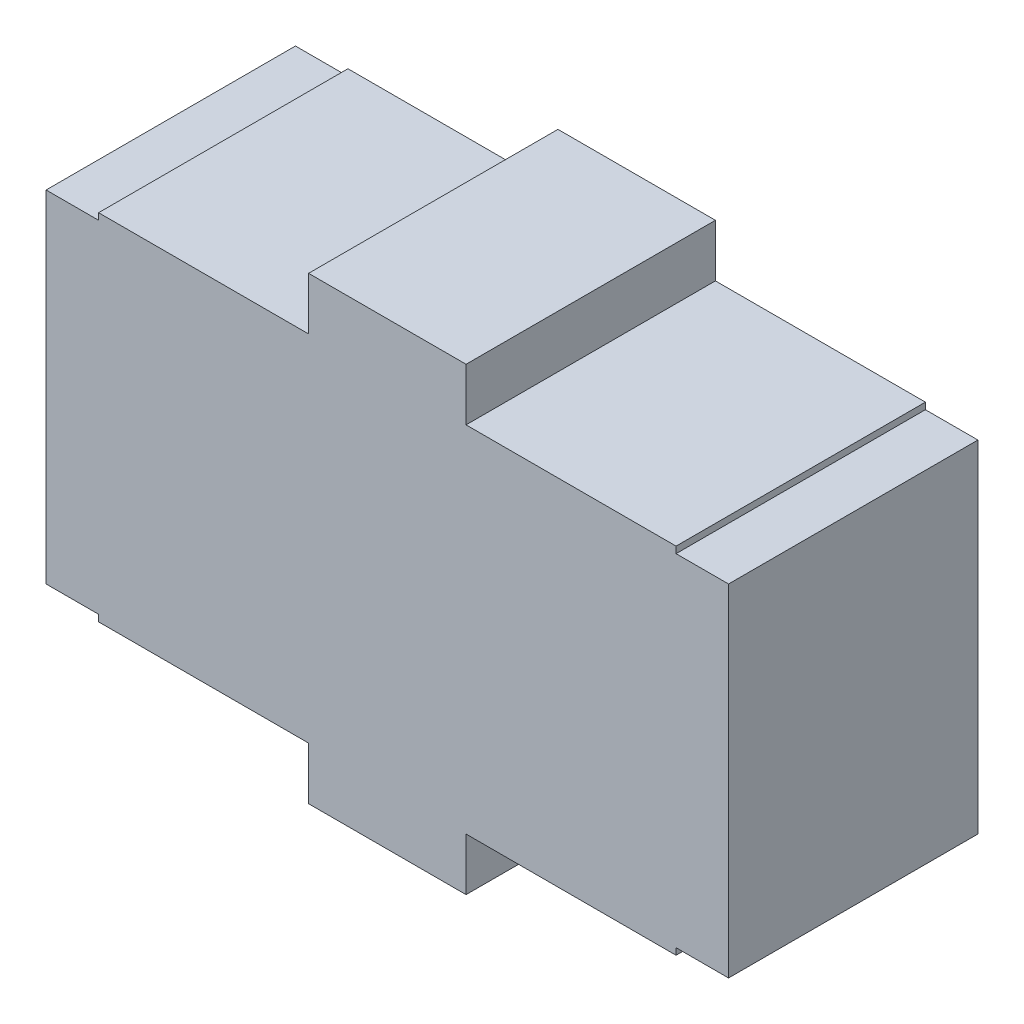
ISO-10303-21;
HEADER;
FILE_DESCRIPTION(('STEP AP214'),'2;1');
FILE_NAME('part.step','',(''),(''),'','','');
FILE_SCHEMA(('AUTOMOTIVE_DESIGN { 1 0 10303 214 1 1 1 1 }'));
ENDSEC;
DATA;
#1=APPLICATION_CONTEXT('core data for automotive mechanical design processes');
#2=APPLICATION_PROTOCOL_DEFINITION('international standard','automotive_design',2000,#1);
#3=PRODUCT_CONTEXT('',#1,'mechanical');
#4=PRODUCT('Part','Part','',(#3));
#5=PRODUCT_RELATED_PRODUCT_CATEGORY('part','',(#4));
#6=PRODUCT_DEFINITION_FORMATION('','',#4);
#7=PRODUCT_DEFINITION_CONTEXT('part definition',#1,'design');
#8=PRODUCT_DEFINITION('design','',#6,#7);
#9=PRODUCT_DEFINITION_SHAPE('','',#8);
#10=(LENGTH_UNIT() NAMED_UNIT(*) SI_UNIT(.MILLI.,.METRE.));
#11=(NAMED_UNIT(*) PLANE_ANGLE_UNIT() SI_UNIT($,.RADIAN.));
#12=(NAMED_UNIT(*) SI_UNIT($,.STERADIAN.) SOLID_ANGLE_UNIT());
#13=UNCERTAINTY_MEASURE_WITH_UNIT(LENGTH_MEASURE(1.E-05),#10,'distance_accuracy_value','');
#14=(GEOMETRIC_REPRESENTATION_CONTEXT(3) GLOBAL_UNCERTAINTY_ASSIGNED_CONTEXT((#13)) GLOBAL_UNIT_ASSIGNED_CONTEXT((#10,
#11,#12)) REPRESENTATION_CONTEXT('',''));
#15=CARTESIAN_POINT('',(0.,0.,0.));
#16=DIRECTION('',(0.,0.,1.));
#17=DIRECTION('',(1.,0.,0.));
#18=AXIS2_PLACEMENT_3D('',#15,#16,#17);
#19=CARTESIAN_POINT('',(0.3,-0.875,0.95));
#20=DIRECTION('',(0.,1.,0.));
#21=DIRECTION('',(0.,0.,1.));
#22=AXIS2_PLACEMENT_3D('',#19,#20,#21);
#23=PLANE('',#22);
#24=DIRECTION('',(1.,0.,0.));
#25=VECTOR('',#24,1.);
#26=CARTESIAN_POINT('',(0.3,-0.875,0.));
#27=LINE('',#26,#25);
#28=CARTESIAN_POINT('',(-0.3,-0.875,0.));
#29=VERTEX_POINT('',#28);
#30=CARTESIAN_POINT('',(0.3,-0.875,0.));
#31=VERTEX_POINT('',#30);
#32=EDGE_CURVE('E202',#29,#31,#27,.T.);
#33=ORIENTED_EDGE('',*,*,#32,.T.);
#34=DIRECTION('',(0.,0.,-1.));
#35=VECTOR('',#34,1.);
#36=CARTESIAN_POINT('',(0.3,-0.875,0.95));
#37=LINE('',#36,#35);
#38=CARTESIAN_POINT('',(0.3,-0.875,0.95));
#39=VERTEX_POINT('',#38);
#40=EDGE_CURVE('E11',#39,#31,#37,.T.);
#41=ORIENTED_EDGE('',*,*,#40,.F.);
#42=DIRECTION('',(1.,0.,0.));
#43=VECTOR('',#42,1.);
#44=CARTESIAN_POINT('',(0.3,-0.875,0.95));
#45=LINE('',#44,#43);
#46=CARTESIAN_POINT('',(-0.3,-0.875,0.95));
#47=VERTEX_POINT('',#46);
#48=EDGE_CURVE('E240',#47,#39,#45,.T.);
#49=ORIENTED_EDGE('',*,*,#48,.F.);
#50=DIRECTION('',(0.,0.,-1.));
#51=VECTOR('',#50,1.);
#52=CARTESIAN_POINT('',(-0.3,-0.875,0.95));
#53=LINE('',#52,#51);
#54=EDGE_CURVE('E198',#47,#29,#53,.T.);
#55=ORIENTED_EDGE('',*,*,#54,.T.);
#56=EDGE_LOOP('',(#33,#41,#49,#55));
#57=FACE_BOUND('',#56,.T.);
#58=ADVANCED_FACE('F34',(#57),#23,.F.);
#59=CARTESIAN_POINT('',(0.3,-0.675,0.95));
#60=DIRECTION('',(-1.,0.,0.));
#61=DIRECTION('',(0.,0.,1.));
#62=AXIS2_PLACEMENT_3D('',#59,#60,#61);
#63=PLANE('',#62);
#64=DIRECTION('',(0.,1.,0.));
#65=VECTOR('',#64,1.);
#66=CARTESIAN_POINT('',(0.3,-0.675,0.));
#67=LINE('',#66,#65);
#68=CARTESIAN_POINT('',(0.3,-0.675,0.));
#69=VERTEX_POINT('',#68);
#70=EDGE_CURVE('E205',#31,#69,#67,.T.);
#71=ORIENTED_EDGE('',*,*,#70,.T.);
#72=DIRECTION('',(0.,0.,-1.));
#73=VECTOR('',#72,1.);
#74=CARTESIAN_POINT('',(0.3,-0.675,0.95));
#75=LINE('',#74,#73);
#76=CARTESIAN_POINT('',(0.3,-0.675,0.95));
#77=VERTEX_POINT('',#76);
#78=EDGE_CURVE('E42',#77,#69,#75,.T.);
#79=ORIENTED_EDGE('',*,*,#78,.F.);
#80=DIRECTION('',(0.,1.,0.));
#81=VECTOR('',#80,1.);
#82=CARTESIAN_POINT('',(0.3,-0.675,0.95));
#83=LINE('',#82,#81);
#84=EDGE_CURVE('E129',#39,#77,#83,.T.);
#85=ORIENTED_EDGE('',*,*,#84,.F.);
#86=ORIENTED_EDGE('',*,*,#40,.T.);
#87=EDGE_LOOP('',(#71,#79,#85,#86));
#88=FACE_BOUND('',#87,.T.);
#89=ADVANCED_FACE('F358',(#88),#63,.F.);
#90=CARTESIAN_POINT('',(1.1,-0.675,0.95));
#91=DIRECTION('',(0.,1.,0.));
#92=DIRECTION('',(0.,0.,1.));
#93=AXIS2_PLACEMENT_3D('',#90,#91,#92);
#94=PLANE('',#93);
#95=DIRECTION('',(1.,0.,0.));
#96=VECTOR('',#95,1.);
#97=CARTESIAN_POINT('',(1.1,-0.675,0.));
#98=LINE('',#97,#96);
#99=CARTESIAN_POINT('',(1.1,-0.675,0.));
#100=VERTEX_POINT('',#99);
#101=EDGE_CURVE('E207',#69,#100,#98,.T.);
#102=ORIENTED_EDGE('',*,*,#101,.T.);
#103=DIRECTION('',(0.,0.,-1.));
#104=VECTOR('',#103,1.);
#105=CARTESIAN_POINT('',(1.1,-0.675,0.95));
#106=LINE('',#105,#104);
#107=CARTESIAN_POINT('',(1.1,-0.675,0.95));
#108=VERTEX_POINT('',#107);
#109=EDGE_CURVE('E283',#108,#100,#106,.T.);
#110=ORIENTED_EDGE('',*,*,#109,.F.);
#111=DIRECTION('',(1.,0.,0.));
#112=VECTOR('',#111,1.);
#113=CARTESIAN_POINT('',(1.1,-0.675,0.95));
#114=LINE('',#113,#112);
#115=EDGE_CURVE('E291',#77,#108,#114,.T.);
#116=ORIENTED_EDGE('',*,*,#115,.F.);
#117=ORIENTED_EDGE('',*,*,#78,.T.);
#118=EDGE_LOOP('',(#102,#110,#116,#117));
#119=FACE_BOUND('',#118,.T.);
#120=ADVANCED_FACE('F289',(#119),#94,.F.);
#121=CARTESIAN_POINT('',(1.1,-0.65,0.95));
#122=DIRECTION('',(-1.,0.,0.));
#123=DIRECTION('',(0.,0.,1.));
#124=AXIS2_PLACEMENT_3D('',#121,#122,#123);
#125=PLANE('',#124);
#126=DIRECTION('',(0.,1.,0.));
#127=VECTOR('',#126,1.);
#128=CARTESIAN_POINT('',(1.1,-0.65,0.));
#129=LINE('',#128,#127);
#130=CARTESIAN_POINT('',(1.1,-0.65,0.));
#131=VERTEX_POINT('',#130);
#132=EDGE_CURVE('E209',#100,#131,#129,.T.);
#133=ORIENTED_EDGE('',*,*,#132,.T.);
#134=DIRECTION('',(0.,0.,-1.));
#135=VECTOR('',#134,1.);
#136=CARTESIAN_POINT('',(1.1,-0.65,0.95));
#137=LINE('',#136,#135);
#138=CARTESIAN_POINT('',(1.1,-0.65,0.95));
#139=VERTEX_POINT('',#138);
#140=EDGE_CURVE('E280',#139,#131,#137,.T.);
#141=ORIENTED_EDGE('',*,*,#140,.F.);
#142=DIRECTION('',(0.,1.,0.));
#143=VECTOR('',#142,1.);
#144=CARTESIAN_POINT('',(1.1,-0.65,0.95));
#145=LINE('',#144,#143);
#146=EDGE_CURVE('E309',#108,#139,#145,.T.);
#147=ORIENTED_EDGE('',*,*,#146,.F.);
#148=ORIENTED_EDGE('',*,*,#109,.T.);
#149=EDGE_LOOP('',(#133,#141,#147,#148));
#150=FACE_BOUND('',#149,.T.);
#151=ADVANCED_FACE('F300',(#150),#125,.F.);
#152=CARTESIAN_POINT('',(1.3,-0.65,0.95));
#153=DIRECTION('',(0.,1.,0.));
#154=DIRECTION('',(0.,0.,1.));
#155=AXIS2_PLACEMENT_3D('',#152,#153,#154);
#156=PLANE('',#155);
#157=DIRECTION('',(1.,0.,0.));
#158=VECTOR('',#157,1.);
#159=CARTESIAN_POINT('',(1.3,-0.65,0.));
#160=LINE('',#159,#158);
#161=CARTESIAN_POINT('',(1.3,-0.65,0.));
#162=VERTEX_POINT('',#161);
#163=EDGE_CURVE('E211',#131,#162,#160,.T.);
#164=ORIENTED_EDGE('',*,*,#163,.T.);
#165=DIRECTION('',(0.,0.,-1.));
#166=VECTOR('',#165,1.);
#167=CARTESIAN_POINT('',(1.3,-0.65,0.95));
#168=LINE('',#167,#166);
#169=CARTESIAN_POINT('',(1.3,-0.65,0.95));
#170=VERTEX_POINT('',#169);
#171=EDGE_CURVE('E277',#170,#162,#168,.T.);
#172=ORIENTED_EDGE('',*,*,#171,.F.);
#173=DIRECTION('',(1.,0.,0.));
#174=VECTOR('',#173,1.);
#175=CARTESIAN_POINT('',(1.3,-0.65,0.95));
#176=LINE('',#175,#174);
#177=EDGE_CURVE('E306',#139,#170,#176,.T.);
#178=ORIENTED_EDGE('',*,*,#177,.F.);
#179=ORIENTED_EDGE('',*,*,#140,.T.);
#180=EDGE_LOOP('',(#164,#172,#178,#179));
#181=FACE_BOUND('',#180,.T.);
#182=ADVANCED_FACE('F304',(#181),#156,.F.);
#183=CARTESIAN_POINT('',(1.3,0.65,0.95));
#184=DIRECTION('',(-1.,0.,0.));
#185=DIRECTION('',(0.,0.,1.));
#186=AXIS2_PLACEMENT_3D('',#183,#184,#185);
#187=PLANE('',#186);
#188=DIRECTION('',(0.,1.,0.));
#189=VECTOR('',#188,1.);
#190=CARTESIAN_POINT('',(1.3,0.65,0.));
#191=LINE('',#190,#189);
#192=CARTESIAN_POINT('',(1.3,0.65,0.));
#193=VERTEX_POINT('',#192);
#194=EDGE_CURVE('E213',#162,#193,#191,.T.);
#195=ORIENTED_EDGE('',*,*,#194,.T.);
#196=DIRECTION('',(0.,0.,-1.));
#197=VECTOR('',#196,1.);
#198=CARTESIAN_POINT('',(1.3,0.65,0.95));
#199=LINE('',#198,#197);
#200=CARTESIAN_POINT('',(1.3,0.65,0.95));
#201=VERTEX_POINT('',#200);
#202=EDGE_CURVE('E274',#201,#193,#199,.T.);
#203=ORIENTED_EDGE('',*,*,#202,.F.);
#204=DIRECTION('',(0.,1.,0.));
#205=VECTOR('',#204,1.);
#206=CARTESIAN_POINT('',(1.3,0.65,0.95));
#207=LINE('',#206,#205);
#208=EDGE_CURVE('E308',#170,#201,#207,.T.);
#209=ORIENTED_EDGE('',*,*,#208,.F.);
#210=ORIENTED_EDGE('',*,*,#171,.T.);
#211=EDGE_LOOP('',(#195,#203,#209,#210));
#212=FACE_BOUND('',#211,.T.);
#213=ADVANCED_FACE('F371',(#212),#187,.F.);
#214=CARTESIAN_POINT('',(1.1,0.65,0.95));
#215=DIRECTION('',(0.,-1.,0.));
#216=DIRECTION('',(0.,0.,-1.));
#217=AXIS2_PLACEMENT_3D('',#214,#215,#216);
#218=PLANE('',#217);
#219=DIRECTION('',(-1.,0.,0.));
#220=VECTOR('',#219,1.);
#221=CARTESIAN_POINT('',(1.1,0.65,0.));
#222=LINE('',#221,#220);
#223=CARTESIAN_POINT('',(1.1,0.65,0.));
#224=VERTEX_POINT('',#223);
#225=EDGE_CURVE('E215',#193,#224,#222,.T.);
#226=ORIENTED_EDGE('',*,*,#225,.T.);
#227=DIRECTION('',(0.,0.,-1.));
#228=VECTOR('',#227,1.);
#229=CARTESIAN_POINT('',(1.1,0.65,0.95));
#230=LINE('',#229,#228);
#231=CARTESIAN_POINT('',(1.1,0.65,0.95));
#232=VERTEX_POINT('',#231);
#233=EDGE_CURVE('E271',#232,#224,#230,.T.);
#234=ORIENTED_EDGE('',*,*,#233,.F.);
#235=DIRECTION('',(-1.,0.,0.));
#236=VECTOR('',#235,1.);
#237=CARTESIAN_POINT('',(1.1,0.65,0.95));
#238=LINE('',#237,#236);
#239=EDGE_CURVE('E311',#201,#232,#238,.T.);
#240=ORIENTED_EDGE('',*,*,#239,.F.);
#241=ORIENTED_EDGE('',*,*,#202,.T.);
#242=EDGE_LOOP('',(#226,#234,#240,#241));
#243=FACE_BOUND('',#242,.T.);
#244=ADVANCED_FACE('F374',(#243),#218,.F.);
#245=CARTESIAN_POINT('',(1.1,0.675,0.95));
#246=DIRECTION('',(-1.,0.,0.));
#247=DIRECTION('',(0.,0.,1.));
#248=AXIS2_PLACEMENT_3D('',#245,#246,#247);
#249=PLANE('',#248);
#250=DIRECTION('',(0.,1.,0.));
#251=VECTOR('',#250,1.);
#252=CARTESIAN_POINT('',(1.1,0.675,0.));
#253=LINE('',#252,#251);
#254=CARTESIAN_POINT('',(1.1,0.675,0.));
#255=VERTEX_POINT('',#254);
#256=EDGE_CURVE('E217',#224,#255,#253,.T.);
#257=ORIENTED_EDGE('',*,*,#256,.T.);
#258=DIRECTION('',(0.,0.,-1.));
#259=VECTOR('',#258,1.);
#260=CARTESIAN_POINT('',(1.1,0.675,0.95));
#261=LINE('',#260,#259);
#262=CARTESIAN_POINT('',(1.1,0.675,0.95));
#263=VERTEX_POINT('',#262);
#264=EDGE_CURVE('E268',#263,#255,#261,.T.);
#265=ORIENTED_EDGE('',*,*,#264,.F.);
#266=DIRECTION('',(0.,1.,0.));
#267=VECTOR('',#266,1.);
#268=CARTESIAN_POINT('',(1.1,0.675,0.95));
#269=LINE('',#268,#267);
#270=EDGE_CURVE('E317',#232,#263,#269,.T.);
#271=ORIENTED_EDGE('',*,*,#270,.F.);
#272=ORIENTED_EDGE('',*,*,#233,.T.);
#273=EDGE_LOOP('',(#257,#265,#271,#272));
#274=FACE_BOUND('',#273,.T.);
#275=ADVANCED_FACE('F378',(#274),#249,.F.);
#276=CARTESIAN_POINT('',(0.3,0.675,0.95));
#277=DIRECTION('',(0.,-1.,0.));
#278=DIRECTION('',(0.,0.,-1.));
#279=AXIS2_PLACEMENT_3D('',#276,#277,#278);
#280=PLANE('',#279);
#281=DIRECTION('',(-1.,0.,0.));
#282=VECTOR('',#281,1.);
#283=CARTESIAN_POINT('',(0.3,0.675,0.));
#284=LINE('',#283,#282);
#285=CARTESIAN_POINT('',(0.3,0.675,0.));
#286=VERTEX_POINT('',#285);
#287=EDGE_CURVE('E219',#255,#286,#284,.T.);
#288=ORIENTED_EDGE('',*,*,#287,.T.);
#289=DIRECTION('',(0.,0.,-1.));
#290=VECTOR('',#289,1.);
#291=CARTESIAN_POINT('',(0.3,0.675,0.95));
#292=LINE('',#291,#290);
#293=CARTESIAN_POINT('',(0.3,0.675,0.95));
#294=VERTEX_POINT('',#293);
#295=EDGE_CURVE('E265',#294,#286,#292,.T.);
#296=ORIENTED_EDGE('',*,*,#295,.F.);
#297=DIRECTION('',(-1.,0.,0.));
#298=VECTOR('',#297,1.);
#299=CARTESIAN_POINT('',(0.3,0.675,0.95));
#300=LINE('',#299,#298);
#301=EDGE_CURVE('E319',#263,#294,#300,.T.);
#302=ORIENTED_EDGE('',*,*,#301,.F.);
#303=ORIENTED_EDGE('',*,*,#264,.T.);
#304=EDGE_LOOP('',(#288,#296,#302,#303));
#305=FACE_BOUND('',#304,.T.);
#306=ADVANCED_FACE('F382',(#305),#280,.F.);
#307=CARTESIAN_POINT('',(0.3,0.875,0.95));
#308=DIRECTION('',(-1.,0.,0.));
#309=DIRECTION('',(0.,0.,1.));
#310=AXIS2_PLACEMENT_3D('',#307,#308,#309);
#311=PLANE('',#310);
#312=DIRECTION('',(0.,1.,0.));
#313=VECTOR('',#312,1.);
#314=CARTESIAN_POINT('',(0.3,0.875,0.));
#315=LINE('',#314,#313);
#316=CARTESIAN_POINT('',(0.3,0.875,0.));
#317=VERTEX_POINT('',#316);
#318=EDGE_CURVE('E221',#286,#317,#315,.T.);
#319=ORIENTED_EDGE('',*,*,#318,.T.);
#320=DIRECTION('',(0.,0.,-1.));
#321=VECTOR('',#320,1.);
#322=CARTESIAN_POINT('',(0.3,0.875,0.95));
#323=LINE('',#322,#321);
#324=CARTESIAN_POINT('',(0.3,0.875,0.95));
#325=VERTEX_POINT('',#324);
#326=EDGE_CURVE('E262',#325,#317,#323,.T.);
#327=ORIENTED_EDGE('',*,*,#326,.F.);
#328=DIRECTION('',(0.,1.,0.));
#329=VECTOR('',#328,1.);
#330=CARTESIAN_POINT('',(0.3,0.875,0.95));
#331=LINE('',#330,#329);
#332=EDGE_CURVE('E321',#294,#325,#331,.T.);
#333=ORIENTED_EDGE('',*,*,#332,.F.);
#334=ORIENTED_EDGE('',*,*,#295,.T.);
#335=EDGE_LOOP('',(#319,#327,#333,#334));
#336=FACE_BOUND('',#335,.T.);
#337=ADVANCED_FACE('F386',(#336),#311,.F.);
#338=CARTESIAN_POINT('',(-0.3,0.875,0.95));
#339=DIRECTION('',(0.,-1.,0.));
#340=DIRECTION('',(0.,0.,-1.));
#341=AXIS2_PLACEMENT_3D('',#338,#339,#340);
#342=PLANE('',#341);
#343=DIRECTION('',(-1.,0.,0.));
#344=VECTOR('',#343,1.);
#345=CARTESIAN_POINT('',(-0.3,0.875,0.));
#346=LINE('',#345,#344);
#347=CARTESIAN_POINT('',(-0.3,0.875,0.));
#348=VERTEX_POINT('',#347);
#349=EDGE_CURVE('E223',#317,#348,#346,.T.);
#350=ORIENTED_EDGE('',*,*,#349,.T.);
#351=DIRECTION('',(0.,0.,-1.));
#352=VECTOR('',#351,1.);
#353=CARTESIAN_POINT('',(-0.3,0.875,0.95));
#354=LINE('',#353,#352);
#355=CARTESIAN_POINT('',(-0.3,0.875,0.95));
#356=VERTEX_POINT('',#355);
#357=EDGE_CURVE('E259',#356,#348,#354,.T.);
#358=ORIENTED_EDGE('',*,*,#357,.F.);
#359=DIRECTION('',(-1.,0.,0.));
#360=VECTOR('',#359,1.);
#361=CARTESIAN_POINT('',(-0.3,0.875,0.95));
#362=LINE('',#361,#360);
#363=EDGE_CURVE('E323',#325,#356,#362,.T.);
#364=ORIENTED_EDGE('',*,*,#363,.F.);
#365=ORIENTED_EDGE('',*,*,#326,.T.);
#366=EDGE_LOOP('',(#350,#358,#364,#365));
#367=FACE_BOUND('',#366,.T.);
#368=ADVANCED_FACE('F390',(#367),#342,.F.);
#369=CARTESIAN_POINT('',(-0.3,0.675,0.95));
#370=DIRECTION('',(1.,0.,0.));
#371=DIRECTION('',(0.,0.,-1.));
#372=AXIS2_PLACEMENT_3D('',#369,#370,#371);
#373=PLANE('',#372);
#374=DIRECTION('',(0.,-1.,0.));
#375=VECTOR('',#374,1.);
#376=CARTESIAN_POINT('',(-0.3,0.675,0.));
#377=LINE('',#376,#375);
#378=CARTESIAN_POINT('',(-0.3,0.675,0.));
#379=VERTEX_POINT('',#378);
#380=EDGE_CURVE('E225',#348,#379,#377,.T.);
#381=ORIENTED_EDGE('',*,*,#380,.T.);
#382=DIRECTION('',(0.,0.,-1.));
#383=VECTOR('',#382,1.);
#384=CARTESIAN_POINT('',(-0.3,0.675,0.95));
#385=LINE('',#384,#383);
#386=CARTESIAN_POINT('',(-0.3,0.675,0.95));
#387=VERTEX_POINT('',#386);
#388=EDGE_CURVE('E256',#387,#379,#385,.T.);
#389=ORIENTED_EDGE('',*,*,#388,.F.);
#390=DIRECTION('',(0.,-1.,0.));
#391=VECTOR('',#390,1.);
#392=CARTESIAN_POINT('',(-0.3,0.675,0.95));
#393=LINE('',#392,#391);
#394=EDGE_CURVE('E325',#356,#387,#393,.T.);
#395=ORIENTED_EDGE('',*,*,#394,.F.);
#396=ORIENTED_EDGE('',*,*,#357,.T.);
#397=EDGE_LOOP('',(#381,#389,#395,#396));
#398=FACE_BOUND('',#397,.T.);
#399=ADVANCED_FACE('F394',(#398),#373,.F.);
#400=CARTESIAN_POINT('',(-1.1,0.675,0.95));
#401=DIRECTION('',(0.,-1.,0.));
#402=DIRECTION('',(0.,0.,-1.));
#403=AXIS2_PLACEMENT_3D('',#400,#401,#402);
#404=PLANE('',#403);
#405=DIRECTION('',(-1.,0.,0.));
#406=VECTOR('',#405,1.);
#407=CARTESIAN_POINT('',(-1.1,0.675,0.));
#408=LINE('',#407,#406);
#409=CARTESIAN_POINT('',(-1.1,0.675,0.));
#410=VERTEX_POINT('',#409);
#411=EDGE_CURVE('E227',#379,#410,#408,.T.);
#412=ORIENTED_EDGE('',*,*,#411,.T.);
#413=DIRECTION('',(0.,0.,-1.));
#414=VECTOR('',#413,1.);
#415=CARTESIAN_POINT('',(-1.1,0.675,0.95));
#416=LINE('',#415,#414);
#417=CARTESIAN_POINT('',(-1.1,0.675,0.95));
#418=VERTEX_POINT('',#417);
#419=EDGE_CURVE('E253',#418,#410,#416,.T.);
#420=ORIENTED_EDGE('',*,*,#419,.F.);
#421=DIRECTION('',(-1.,0.,0.));
#422=VECTOR('',#421,1.);
#423=CARTESIAN_POINT('',(-1.1,0.675,0.95));
#424=LINE('',#423,#422);
#425=EDGE_CURVE('E327',#387,#418,#424,.T.);
#426=ORIENTED_EDGE('',*,*,#425,.F.);
#427=ORIENTED_EDGE('',*,*,#388,.T.);
#428=EDGE_LOOP('',(#412,#420,#426,#427));
#429=FACE_BOUND('',#428,.T.);
#430=ADVANCED_FACE('F398',(#429),#404,.F.);
#431=CARTESIAN_POINT('',(-1.1,0.65,0.95));
#432=DIRECTION('',(1.,0.,0.));
#433=DIRECTION('',(0.,0.,-1.));
#434=AXIS2_PLACEMENT_3D('',#431,#432,#433);
#435=PLANE('',#434);
#436=DIRECTION('',(0.,-1.,0.));
#437=VECTOR('',#436,1.);
#438=CARTESIAN_POINT('',(-1.1,0.65,0.));
#439=LINE('',#438,#437);
#440=CARTESIAN_POINT('',(-1.1,0.65,0.));
#441=VERTEX_POINT('',#440);
#442=EDGE_CURVE('E229',#410,#441,#439,.T.);
#443=ORIENTED_EDGE('',*,*,#442,.T.);
#444=DIRECTION('',(0.,0.,-1.));
#445=VECTOR('',#444,1.);
#446=CARTESIAN_POINT('',(-1.1,0.65,0.95));
#447=LINE('',#446,#445);
#448=CARTESIAN_POINT('',(-1.1,0.65,0.95));
#449=VERTEX_POINT('',#448);
#450=EDGE_CURVE('E250',#449,#441,#447,.T.);
#451=ORIENTED_EDGE('',*,*,#450,.F.);
#452=DIRECTION('',(0.,-1.,0.));
#453=VECTOR('',#452,1.);
#454=CARTESIAN_POINT('',(-1.1,0.65,0.95));
#455=LINE('',#454,#453);
#456=EDGE_CURVE('E329',#418,#449,#455,.T.);
#457=ORIENTED_EDGE('',*,*,#456,.F.);
#458=ORIENTED_EDGE('',*,*,#419,.T.);
#459=EDGE_LOOP('',(#443,#451,#457,#458));
#460=FACE_BOUND('',#459,.T.);
#461=ADVANCED_FACE('F402',(#460),#435,.F.);
#462=CARTESIAN_POINT('',(-1.3,0.65,0.95));
#463=DIRECTION('',(0.,-1.,0.));
#464=DIRECTION('',(0.,0.,-1.));
#465=AXIS2_PLACEMENT_3D('',#462,#463,#464);
#466=PLANE('',#465);
#467=DIRECTION('',(-1.,0.,0.));
#468=VECTOR('',#467,1.);
#469=CARTESIAN_POINT('',(-1.3,0.65,0.));
#470=LINE('',#469,#468);
#471=CARTESIAN_POINT('',(-1.3,0.65,0.));
#472=VERTEX_POINT('',#471);
#473=EDGE_CURVE('E231',#441,#472,#470,.T.);
#474=ORIENTED_EDGE('',*,*,#473,.T.);
#475=DIRECTION('',(0.,0.,-1.));
#476=VECTOR('',#475,1.);
#477=CARTESIAN_POINT('',(-1.3,0.65,0.95));
#478=LINE('',#477,#476);
#479=CARTESIAN_POINT('',(-1.3,0.65,0.95));
#480=VERTEX_POINT('',#479);
#481=EDGE_CURVE('E247',#480,#472,#478,.T.);
#482=ORIENTED_EDGE('',*,*,#481,.F.);
#483=DIRECTION('',(-1.,0.,0.));
#484=VECTOR('',#483,1.);
#485=CARTESIAN_POINT('',(-1.3,0.65,0.95));
#486=LINE('',#485,#484);
#487=EDGE_CURVE('E331',#449,#480,#486,.T.);
#488=ORIENTED_EDGE('',*,*,#487,.F.);
#489=ORIENTED_EDGE('',*,*,#450,.T.);
#490=EDGE_LOOP('',(#474,#482,#488,#489));
#491=FACE_BOUND('',#490,.T.);
#492=ADVANCED_FACE('F406',(#491),#466,.F.);
#493=CARTESIAN_POINT('',(-1.3,-0.65,0.95));
#494=DIRECTION('',(1.,0.,0.));
#495=DIRECTION('',(0.,0.,-1.));
#496=AXIS2_PLACEMENT_3D('',#493,#494,#495);
#497=PLANE('',#496);
#498=DIRECTION('',(0.,-1.,0.));
#499=VECTOR('',#498,1.);
#500=CARTESIAN_POINT('',(-1.3,-0.65,0.));
#501=LINE('',#500,#499);
#502=CARTESIAN_POINT('',(-1.3,-0.65,0.));
#503=VERTEX_POINT('',#502);
#504=EDGE_CURVE('E233',#472,#503,#501,.T.);
#505=ORIENTED_EDGE('',*,*,#504,.T.);
#506=DIRECTION('',(0.,0.,-1.));
#507=VECTOR('',#506,1.);
#508=CARTESIAN_POINT('',(-1.3,-0.65,0.95));
#509=LINE('',#508,#507);
#510=CARTESIAN_POINT('',(-1.3,-0.65,0.95));
#511=VERTEX_POINT('',#510);
#512=EDGE_CURVE('E244',#511,#503,#509,.T.);
#513=ORIENTED_EDGE('',*,*,#512,.F.);
#514=DIRECTION('',(0.,-1.,0.));
#515=VECTOR('',#514,1.);
#516=CARTESIAN_POINT('',(-1.3,-0.65,0.95));
#517=LINE('',#516,#515);
#518=EDGE_CURVE('E333',#480,#511,#517,.T.);
#519=ORIENTED_EDGE('',*,*,#518,.F.);
#520=ORIENTED_EDGE('',*,*,#481,.T.);
#521=EDGE_LOOP('',(#505,#513,#519,#520));
#522=FACE_BOUND('',#521,.T.);
#523=ADVANCED_FACE('F339',(#522),#497,.F.);
#524=CARTESIAN_POINT('',(-1.1,-0.65,0.95));
#525=DIRECTION('',(0.,1.,0.));
#526=DIRECTION('',(0.,0.,1.));
#527=AXIS2_PLACEMENT_3D('',#524,#525,#526);
#528=PLANE('',#527);
#529=DIRECTION('',(1.,0.,0.));
#530=VECTOR('',#529,1.);
#531=CARTESIAN_POINT('',(-1.1,-0.65,0.));
#532=LINE('',#531,#530);
#533=CARTESIAN_POINT('',(-1.1,-0.65,0.));
#534=VERTEX_POINT('',#533);
#535=EDGE_CURVE('E235',#503,#534,#532,.T.);
#536=ORIENTED_EDGE('',*,*,#535,.T.);
#537=DIRECTION('',(0.,0.,-1.));
#538=VECTOR('',#537,1.);
#539=CARTESIAN_POINT('',(-1.1,-0.65,0.95));
#540=LINE('',#539,#538);
#541=CARTESIAN_POINT('',(-1.1,-0.65,0.95));
#542=VERTEX_POINT('',#541);
#543=EDGE_CURVE('E193',#542,#534,#540,.T.);
#544=ORIENTED_EDGE('',*,*,#543,.F.);
#545=DIRECTION('',(1.,0.,0.));
#546=VECTOR('',#545,1.);
#547=CARTESIAN_POINT('',(-1.1,-0.65,0.95));
#548=LINE('',#547,#546);
#549=EDGE_CURVE('E184',#511,#542,#548,.T.);
#550=ORIENTED_EDGE('',*,*,#549,.F.);
#551=ORIENTED_EDGE('',*,*,#512,.T.);
#552=EDGE_LOOP('',(#536,#544,#550,#551));
#553=FACE_BOUND('',#552,.T.);
#554=ADVANCED_FACE('F343',(#553),#528,.F.);
#555=CARTESIAN_POINT('',(-1.1,-0.675,0.95));
#556=DIRECTION('',(1.,0.,0.));
#557=DIRECTION('',(0.,0.,-1.));
#558=AXIS2_PLACEMENT_3D('',#555,#556,#557);
#559=PLANE('',#558);
#560=DIRECTION('',(0.,-1.,0.));
#561=VECTOR('',#560,1.);
#562=CARTESIAN_POINT('',(-1.1,-0.675,0.));
#563=LINE('',#562,#561);
#564=CARTESIAN_POINT('',(-1.1,-0.675,0.));
#565=VERTEX_POINT('',#564);
#566=EDGE_CURVE('E192',#534,#565,#563,.T.);
#567=ORIENTED_EDGE('',*,*,#566,.T.);
#568=DIRECTION('',(0.,0.,-1.));
#569=VECTOR('',#568,1.);
#570=CARTESIAN_POINT('',(-1.1,-0.675,0.95));
#571=LINE('',#570,#569);
#572=CARTESIAN_POINT('',(-1.1,-0.675,0.95));
#573=VERTEX_POINT('',#572);
#574=EDGE_CURVE('E189',#573,#565,#571,.T.);
#575=ORIENTED_EDGE('',*,*,#574,.F.);
#576=DIRECTION('',(0.,-1.,0.));
#577=VECTOR('',#576,1.);
#578=CARTESIAN_POINT('',(-1.1,-0.675,0.95));
#579=LINE('',#578,#577);
#580=EDGE_CURVE('E178',#542,#573,#579,.T.);
#581=ORIENTED_EDGE('',*,*,#580,.F.);
#582=ORIENTED_EDGE('',*,*,#543,.T.);
#583=EDGE_LOOP('',(#567,#575,#581,#582));
#584=FACE_BOUND('',#583,.T.);
#585=ADVANCED_FACE('F190',(#584),#559,.F.);
#586=CARTESIAN_POINT('',(-0.3,-0.675,0.95));
#587=DIRECTION('',(0.,1.,0.));
#588=DIRECTION('',(0.,0.,1.));
#589=AXIS2_PLACEMENT_3D('',#586,#587,#588);
#590=PLANE('',#589);
#591=DIRECTION('',(1.,0.,0.));
#592=VECTOR('',#591,1.);
#593=CARTESIAN_POINT('',(-0.3,-0.675,0.));
#594=LINE('',#593,#592);
#595=CARTESIAN_POINT('',(-0.3,-0.675,0.));
#596=VERTEX_POINT('',#595);
#597=EDGE_CURVE('E115',#565,#596,#594,.T.);
#598=ORIENTED_EDGE('',*,*,#597,.T.);
#599=DIRECTION('',(0.,0.,-1.));
#600=VECTOR('',#599,1.);
#601=CARTESIAN_POINT('',(-0.3,-0.675,0.95));
#602=LINE('',#601,#600);
#603=CARTESIAN_POINT('',(-0.3,-0.675,0.95));
#604=VERTEX_POINT('',#603);
#605=EDGE_CURVE('E194',#604,#596,#602,.T.);
#606=ORIENTED_EDGE('',*,*,#605,.F.);
#607=DIRECTION('',(1.,0.,0.));
#608=VECTOR('',#607,1.);
#609=CARTESIAN_POINT('',(-0.3,-0.675,0.95));
#610=LINE('',#609,#608);
#611=EDGE_CURVE('E182',#573,#604,#610,.T.);
#612=ORIENTED_EDGE('',*,*,#611,.F.);
#613=ORIENTED_EDGE('',*,*,#574,.T.);
#614=EDGE_LOOP('',(#598,#606,#612,#613));
#615=FACE_BOUND('',#614,.T.);
#616=ADVANCED_FACE('F196',(#615),#590,.F.);
#617=CARTESIAN_POINT('',(-0.3,-0.875,0.95));
#618=DIRECTION('',(1.,0.,0.));
#619=DIRECTION('',(0.,0.,-1.));
#620=AXIS2_PLACEMENT_3D('',#617,#618,#619);
#621=PLANE('',#620);
#622=DIRECTION('',(0.,-1.,0.));
#623=VECTOR('',#622,1.);
#624=CARTESIAN_POINT('',(-0.3,-0.875,0.));
#625=LINE('',#624,#623);
#626=EDGE_CURVE('E121',#596,#29,#625,.T.);
#627=ORIENTED_EDGE('',*,*,#626,.T.);
#628=ORIENTED_EDGE('',*,*,#54,.F.);
#629=DIRECTION('',(0.,-1.,0.));
#630=VECTOR('',#629,1.);
#631=CARTESIAN_POINT('',(-0.3,-0.875,0.95));
#632=LINE('',#631,#630);
#633=EDGE_CURVE('E50',#604,#47,#632,.T.);
#634=ORIENTED_EDGE('',*,*,#633,.F.);
#635=ORIENTED_EDGE('',*,*,#605,.T.);
#636=EDGE_LOOP('',(#627,#628,#634,#635));
#637=FACE_BOUND('',#636,.T.);
#638=ADVANCED_FACE('F347',(#637),#621,.F.);
#639=CARTESIAN_POINT('',(0.,0.,0.95));
#640=DIRECTION('',(0.,0.,-1.));
#641=DIRECTION('',(-1.,0.,0.));
#642=AXIS2_PLACEMENT_3D('',#639,#640,#641);
#643=PLANE('',#642);
#644=ORIENTED_EDGE('',*,*,#48,.T.);
#645=ORIENTED_EDGE('',*,*,#84,.T.);
#646=ORIENTED_EDGE('',*,*,#115,.T.);
#647=ORIENTED_EDGE('',*,*,#146,.T.);
#648=ORIENTED_EDGE('',*,*,#177,.T.);
#649=ORIENTED_EDGE('',*,*,#208,.T.);
#650=ORIENTED_EDGE('',*,*,#239,.T.);
#651=ORIENTED_EDGE('',*,*,#270,.T.);
#652=ORIENTED_EDGE('',*,*,#301,.T.);
#653=ORIENTED_EDGE('',*,*,#332,.T.);
#654=ORIENTED_EDGE('',*,*,#363,.T.);
#655=ORIENTED_EDGE('',*,*,#394,.T.);
#656=ORIENTED_EDGE('',*,*,#425,.T.);
#657=ORIENTED_EDGE('',*,*,#456,.T.);
#658=ORIENTED_EDGE('',*,*,#487,.T.);
#659=ORIENTED_EDGE('',*,*,#518,.T.);
#660=ORIENTED_EDGE('',*,*,#549,.T.);
#661=ORIENTED_EDGE('',*,*,#580,.T.);
#662=ORIENTED_EDGE('',*,*,#611,.T.);
#663=ORIENTED_EDGE('',*,*,#633,.T.);
#664=EDGE_LOOP('',(#644,#645,#646,#647,#648,#649,#650,#651,#652,#653,#654,#655,#656,#657,#658,
#659,#660,#661,#662,#663));
#665=FACE_BOUND('',#664,.T.);
#666=ADVANCED_FACE('F180',(#665),#643,.F.);
#667=CARTESIAN_POINT('',(0.,0.,0.));
#668=DIRECTION('',(0.,0.,-1.));
#669=DIRECTION('',(-1.,0.,0.));
#670=AXIS2_PLACEMENT_3D('',#667,#668,#669);
#671=PLANE('',#670);
#672=ORIENTED_EDGE('',*,*,#32,.F.);
#673=ORIENTED_EDGE('',*,*,#626,.F.);
#674=ORIENTED_EDGE('',*,*,#597,.F.);
#675=ORIENTED_EDGE('',*,*,#566,.F.);
#676=ORIENTED_EDGE('',*,*,#535,.F.);
#677=ORIENTED_EDGE('',*,*,#504,.F.);
#678=ORIENTED_EDGE('',*,*,#473,.F.);
#679=ORIENTED_EDGE('',*,*,#442,.F.);
#680=ORIENTED_EDGE('',*,*,#411,.F.);
#681=ORIENTED_EDGE('',*,*,#380,.F.);
#682=ORIENTED_EDGE('',*,*,#349,.F.);
#683=ORIENTED_EDGE('',*,*,#318,.F.);
#684=ORIENTED_EDGE('',*,*,#287,.F.);
#685=ORIENTED_EDGE('',*,*,#256,.F.);
#686=ORIENTED_EDGE('',*,*,#225,.F.);
#687=ORIENTED_EDGE('',*,*,#194,.F.);
#688=ORIENTED_EDGE('',*,*,#163,.F.);
#689=ORIENTED_EDGE('',*,*,#132,.F.);
#690=ORIENTED_EDGE('',*,*,#101,.F.);
#691=ORIENTED_EDGE('',*,*,#70,.F.);
#692=EDGE_LOOP('',(#672,#673,#674,#675,#676,#677,#678,#679,#680,#681,#682,#683,#684,#685,#686,
#687,#688,#689,#690,#691));
#693=FACE_BOUND('',#692,.T.);
#694=ADVANCED_FACE('F295',(#693),#671,.T.);
#695=CLOSED_SHELL('',(#58,#89,#120,#151,#182,#213,#244,#275,#306,#337,#368,#399,#430,#461,#492,
#523,#554,#585,#616,#638,#666,#694));
#696=MANIFOLD_SOLID_BREP('B2',#695);
#697=ADVANCED_BREP_SHAPE_REPRESENTATION('',(#18,#696),#14);
#698=SHAPE_DEFINITION_REPRESENTATION(#9,#697);
ENDSEC;
END-ISO-10303-21;
